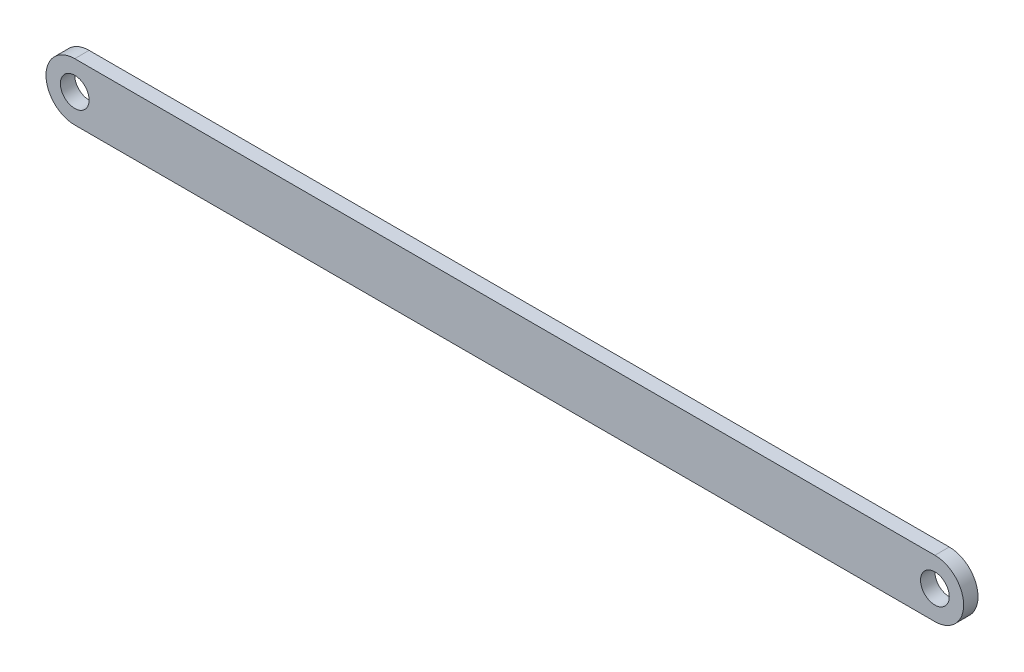
ISO-10303-21;
HEADER;
FILE_DESCRIPTION(('STEP AP214'),'2;1');
FILE_NAME('part.step','',(''),(''),'','','');
FILE_SCHEMA(('AUTOMOTIVE_DESIGN { 1 0 10303 214 1 1 1 1 }'));
ENDSEC;
DATA;
#1=APPLICATION_CONTEXT('core data for automotive mechanical design processes');
#2=APPLICATION_PROTOCOL_DEFINITION('international standard','automotive_design',2000,#1);
#3=PRODUCT_CONTEXT('',#1,'mechanical');
#4=PRODUCT('Part','Part','',(#3));
#5=PRODUCT_RELATED_PRODUCT_CATEGORY('part','',(#4));
#6=PRODUCT_DEFINITION_FORMATION('','',#4);
#7=PRODUCT_DEFINITION_CONTEXT('part definition',#1,'design');
#8=PRODUCT_DEFINITION('design','',#6,#7);
#9=PRODUCT_DEFINITION_SHAPE('','',#8);
#10=(LENGTH_UNIT() NAMED_UNIT(*) SI_UNIT(.MILLI.,.METRE.));
#11=(NAMED_UNIT(*) PLANE_ANGLE_UNIT() SI_UNIT($,.RADIAN.));
#12=(NAMED_UNIT(*) SI_UNIT($,.STERADIAN.) SOLID_ANGLE_UNIT());
#13=UNCERTAINTY_MEASURE_WITH_UNIT(LENGTH_MEASURE(1.E-05),#10,'distance_accuracy_value','');
#14=(GEOMETRIC_REPRESENTATION_CONTEXT(3) GLOBAL_UNCERTAINTY_ASSIGNED_CONTEXT((#13)) GLOBAL_UNIT_ASSIGNED_CONTEXT((#10,
#11,#12)) REPRESENTATION_CONTEXT('',''));
#15=CARTESIAN_POINT('',(0.,0.,0.));
#16=DIRECTION('',(0.,0.,1.));
#17=DIRECTION('',(1.,0.,0.));
#18=AXIS2_PLACEMENT_3D('',#15,#16,#17);
#19=CARTESIAN_POINT('',(29.935,0.,1.));
#20=DIRECTION('',(0.,0.,-1.));
#21=DIRECTION('',(-1.,0.,0.));
#22=AXIS2_PLACEMENT_3D('',#19,#20,#21);
#23=PLANE('',#22);
#24=CARTESIAN_POINT('',(29.935,0.,1.));
#25=DIRECTION('',(0.,0.,1.));
#26=DIRECTION('',(-1.,0.,0.));
#27=AXIS2_PLACEMENT_3D('',#24,#25,#26);
#28=CIRCLE('',#27,2.);
#29=CARTESIAN_POINT('',(29.935,-2.,1.));
#30=VERTEX_POINT('',#29);
#31=CARTESIAN_POINT('',(29.935,2.,1.));
#32=VERTEX_POINT('',#31);
#33=EDGE_CURVE('E90',#30,#32,#28,.T.);
#34=ORIENTED_EDGE('',*,*,#33,.T.);
#35=DIRECTION('',(-1.,0.,0.));
#36=VECTOR('',#35,1.);
#37=CARTESIAN_POINT('',(-29.935,2.,1.));
#38=LINE('',#37,#36);
#39=CARTESIAN_POINT('',(-29.935,2.,1.));
#40=VERTEX_POINT('',#39);
#41=EDGE_CURVE('E85',#32,#40,#38,.T.);
#42=ORIENTED_EDGE('',*,*,#41,.T.);
#43=CARTESIAN_POINT('',(-29.935,0.,1.));
#44=DIRECTION('',(0.,0.,1.));
#45=DIRECTION('',(1.,0.,0.));
#46=AXIS2_PLACEMENT_3D('',#43,#44,#45);
#47=CIRCLE('',#46,2.);
#48=CARTESIAN_POINT('',(-29.935,-2.,1.));
#49=VERTEX_POINT('',#48);
#50=EDGE_CURVE('E88',#40,#49,#47,.T.);
#51=ORIENTED_EDGE('',*,*,#50,.T.);
#52=DIRECTION('',(1.,0.,0.));
#53=VECTOR('',#52,1.);
#54=CARTESIAN_POINT('',(-29.935,-2.,1.));
#55=LINE('',#54,#53);
#56=EDGE_CURVE('E55',#49,#30,#55,.T.);
#57=ORIENTED_EDGE('',*,*,#56,.T.);
#58=EDGE_LOOP('',(#34,#42,#51,#57));
#59=FACE_BOUND('',#58,.T.);
#60=CARTESIAN_POINT('',(-29.935,0.,1.));
#61=DIRECTION('',(0.,0.,1.));
#62=DIRECTION('',(1.,0.,0.));
#63=AXIS2_PLACEMENT_3D('',#60,#61,#62);
#64=CIRCLE('',#63,1.);
#65=CARTESIAN_POINT('',(-28.935,0.,1.));
#66=VERTEX_POINT('',#65);
#67=EDGE_CURVE('E105',#66,#66,#64,.T.);
#68=ORIENTED_EDGE('',*,*,#67,.F.);
#69=EDGE_LOOP('',(#68));
#70=FACE_BOUND('',#69,.T.);
#71=CARTESIAN_POINT('',(29.935,0.,1.));
#72=DIRECTION('',(0.,0.,1.));
#73=DIRECTION('',(1.,0.,0.));
#74=AXIS2_PLACEMENT_3D('',#71,#72,#73);
#75=CIRCLE('',#74,1.);
#76=CARTESIAN_POINT('',(30.935,0.,1.));
#77=VERTEX_POINT('',#76);
#78=EDGE_CURVE('E120',#77,#77,#75,.T.);
#79=ORIENTED_EDGE('',*,*,#78,.F.);
#80=EDGE_LOOP('',(#79));
#81=FACE_BOUND('',#80,.T.);
#82=ADVANCED_FACE('F38',(#59,#70,#81),#23,.F.);
#83=CARTESIAN_POINT('',(29.935,0.,0.));
#84=DIRECTION('',(0.,0.,-1.));
#85=DIRECTION('',(-1.,0.,0.));
#86=AXIS2_PLACEMENT_3D('',#83,#84,#85);
#87=PLANE('',#86);
#88=CARTESIAN_POINT('',(-29.935,0.,0.));
#89=DIRECTION('',(0.,0.,1.));
#90=DIRECTION('',(1.,0.,0.));
#91=AXIS2_PLACEMENT_3D('',#88,#89,#90);
#92=CIRCLE('',#91,1.);
#93=CARTESIAN_POINT('',(-28.935,0.,0.));
#94=VERTEX_POINT('',#93);
#95=EDGE_CURVE('E117',#94,#94,#92,.T.);
#96=ORIENTED_EDGE('',*,*,#95,.T.);
#97=EDGE_LOOP('',(#96));
#98=FACE_BOUND('',#97,.T.);
#99=CARTESIAN_POINT('',(29.935,0.,0.));
#100=DIRECTION('',(0.,0.,1.));
#101=DIRECTION('',(-1.,0.,0.));
#102=AXIS2_PLACEMENT_3D('',#99,#100,#101);
#103=CIRCLE('',#102,2.);
#104=CARTESIAN_POINT('',(29.935,-2.,0.));
#105=VERTEX_POINT('',#104);
#106=CARTESIAN_POINT('',(29.935,2.,0.));
#107=VERTEX_POINT('',#106);
#108=EDGE_CURVE('E102',#105,#107,#103,.T.);
#109=ORIENTED_EDGE('',*,*,#108,.F.);
#110=DIRECTION('',(1.,0.,0.));
#111=VECTOR('',#110,1.);
#112=CARTESIAN_POINT('',(-29.935,-2.,0.));
#113=LINE('',#112,#111);
#114=CARTESIAN_POINT('',(-29.935,-2.,0.));
#115=VERTEX_POINT('',#114);
#116=EDGE_CURVE('E78',#115,#105,#113,.T.);
#117=ORIENTED_EDGE('',*,*,#116,.F.);
#118=CARTESIAN_POINT('',(-29.935,0.,0.));
#119=DIRECTION('',(0.,0.,1.));
#120=DIRECTION('',(1.,0.,0.));
#121=AXIS2_PLACEMENT_3D('',#118,#119,#120);
#122=CIRCLE('',#121,2.);
#123=CARTESIAN_POINT('',(-29.935,2.,0.));
#124=VERTEX_POINT('',#123);
#125=EDGE_CURVE('E72',#124,#115,#122,.T.);
#126=ORIENTED_EDGE('',*,*,#125,.F.);
#127=DIRECTION('',(-1.,0.,0.));
#128=VECTOR('',#127,1.);
#129=CARTESIAN_POINT('',(-29.935,2.,0.));
#130=LINE('',#129,#128);
#131=EDGE_CURVE('E94',#107,#124,#130,.T.);
#132=ORIENTED_EDGE('',*,*,#131,.F.);
#133=EDGE_LOOP('',(#109,#117,#126,#132));
#134=FACE_BOUND('',#133,.T.);
#135=CARTESIAN_POINT('',(29.935,0.,0.));
#136=DIRECTION('',(0.,0.,1.));
#137=DIRECTION('',(1.,0.,0.));
#138=AXIS2_PLACEMENT_3D('',#135,#136,#137);
#139=CIRCLE('',#138,1.);
#140=CARTESIAN_POINT('',(30.935,0.,0.));
#141=VERTEX_POINT('',#140);
#142=EDGE_CURVE('E123',#141,#141,#139,.T.);
#143=ORIENTED_EDGE('',*,*,#142,.T.);
#144=EDGE_LOOP('',(#143));
#145=FACE_BOUND('',#144,.T.);
#146=ADVANCED_FACE('F113',(#98,#134,#145),#87,.T.);
#147=CARTESIAN_POINT('',(29.935,0.,1.));
#148=DIRECTION('',(0.,0.,-1.));
#149=DIRECTION('',(-1.,0.,0.));
#150=AXIS2_PLACEMENT_3D('',#147,#148,#149);
#151=CYLINDRICAL_SURFACE('',#150,2.);
#152=ORIENTED_EDGE('',*,*,#108,.T.);
#153=DIRECTION('',(0.,0.,-1.));
#154=VECTOR('',#153,1.);
#155=CARTESIAN_POINT('',(29.935,2.,1.));
#156=LINE('',#155,#154);
#157=EDGE_CURVE('E11',#32,#107,#156,.T.);
#158=ORIENTED_EDGE('',*,*,#157,.F.);
#159=ORIENTED_EDGE('',*,*,#33,.F.);
#160=DIRECTION('',(0.,0.,-1.));
#161=VECTOR('',#160,1.);
#162=CARTESIAN_POINT('',(29.935,-2.,1.));
#163=LINE('',#162,#161);
#164=EDGE_CURVE('E98',#30,#105,#163,.T.);
#165=ORIENTED_EDGE('',*,*,#164,.T.);
#166=EDGE_LOOP('',(#152,#158,#159,#165));
#167=FACE_BOUND('',#166,.T.);
#168=ADVANCED_FACE('F40',(#167),#151,.T.);
#169=CARTESIAN_POINT('',(-29.935,2.,1.));
#170=DIRECTION('',(0.,-1.,0.));
#171=DIRECTION('',(0.,0.,-1.));
#172=AXIS2_PLACEMENT_3D('',#169,#170,#171);
#173=PLANE('',#172);
#174=ORIENTED_EDGE('',*,*,#131,.T.);
#175=DIRECTION('',(0.,0.,-1.));
#176=VECTOR('',#175,1.);
#177=CARTESIAN_POINT('',(-29.935,2.,1.));
#178=LINE('',#177,#176);
#179=EDGE_CURVE('E47',#40,#124,#178,.T.);
#180=ORIENTED_EDGE('',*,*,#179,.F.);
#181=ORIENTED_EDGE('',*,*,#41,.F.);
#182=ORIENTED_EDGE('',*,*,#157,.T.);
#183=EDGE_LOOP('',(#174,#180,#181,#182));
#184=FACE_BOUND('',#183,.T.);
#185=ADVANCED_FACE('F93',(#184),#173,.F.);
#186=CARTESIAN_POINT('',(-29.935,0.,1.));
#187=DIRECTION('',(0.,0.,-1.));
#188=DIRECTION('',(-1.,0.,0.));
#189=AXIS2_PLACEMENT_3D('',#186,#187,#188);
#190=CYLINDRICAL_SURFACE('',#189,2.);
#191=ORIENTED_EDGE('',*,*,#125,.T.);
#192=DIRECTION('',(0.,0.,-1.));
#193=VECTOR('',#192,1.);
#194=CARTESIAN_POINT('',(-29.935,-2.,1.));
#195=LINE('',#194,#193);
#196=EDGE_CURVE('E95',#49,#115,#195,.T.);
#197=ORIENTED_EDGE('',*,*,#196,.F.);
#198=ORIENTED_EDGE('',*,*,#50,.F.);
#199=ORIENTED_EDGE('',*,*,#179,.T.);
#200=EDGE_LOOP('',(#191,#197,#198,#199));
#201=FACE_BOUND('',#200,.T.);
#202=ADVANCED_FACE('F96',(#201),#190,.T.);
#203=CARTESIAN_POINT('',(-29.935,-2.,1.));
#204=DIRECTION('',(0.,1.,0.));
#205=DIRECTION('',(0.,0.,1.));
#206=AXIS2_PLACEMENT_3D('',#203,#204,#205);
#207=PLANE('',#206);
#208=ORIENTED_EDGE('',*,*,#116,.T.);
#209=ORIENTED_EDGE('',*,*,#164,.F.);
#210=ORIENTED_EDGE('',*,*,#56,.F.);
#211=ORIENTED_EDGE('',*,*,#196,.T.);
#212=EDGE_LOOP('',(#208,#209,#210,#211));
#213=FACE_BOUND('',#212,.T.);
#214=ADVANCED_FACE('F110',(#213),#207,.F.);
#215=CARTESIAN_POINT('',(-29.935,0.,1.));
#216=DIRECTION('',(0.,0.,-1.));
#217=DIRECTION('',(-1.,0.,0.));
#218=AXIS2_PLACEMENT_3D('',#215,#216,#217);
#219=CYLINDRICAL_SURFACE('',#218,1.);
#220=ORIENTED_EDGE('',*,*,#67,.T.);
#221=EDGE_LOOP('',(#220));
#222=FACE_BOUND('',#221,.T.);
#223=ORIENTED_EDGE('',*,*,#95,.F.);
#224=EDGE_LOOP('',(#223));
#225=FACE_BOUND('',#224,.T.);
#226=ADVANCED_FACE('F140',(#222,#225),#219,.F.);
#227=CARTESIAN_POINT('',(29.935,0.,1.));
#228=DIRECTION('',(0.,0.,-1.));
#229=DIRECTION('',(-1.,0.,0.));
#230=AXIS2_PLACEMENT_3D('',#227,#228,#229);
#231=CYLINDRICAL_SURFACE('',#230,1.);
#232=ORIENTED_EDGE('',*,*,#78,.T.);
#233=EDGE_LOOP('',(#232));
#234=FACE_BOUND('',#233,.T.);
#235=ORIENTED_EDGE('',*,*,#142,.F.);
#236=EDGE_LOOP('',(#235));
#237=FACE_BOUND('',#236,.T.);
#238=ADVANCED_FACE('F129',(#234,#237),#231,.F.);
#239=CLOSED_SHELL('',(#82,#146,#168,#185,#202,#214,#226,#238));
#240=MANIFOLD_SOLID_BREP('B2',#239);
#241=ADVANCED_BREP_SHAPE_REPRESENTATION('',(#18,#240),#14);
#242=SHAPE_DEFINITION_REPRESENTATION(#9,#241);
ENDSEC;
END-ISO-10303-21;
